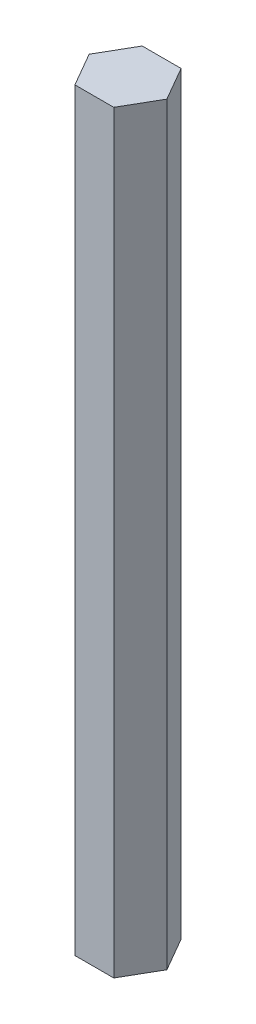
ISO-10303-21;
HEADER;
FILE_DESCRIPTION(('STEP AP214'),'2;1');
FILE_NAME('part.step','',(''),(''),'','','');
FILE_SCHEMA(('AUTOMOTIVE_DESIGN { 1 0 10303 214 1 1 1 1 }'));
ENDSEC;
DATA;
#1=APPLICATION_CONTEXT('core data for automotive mechanical design processes');
#2=APPLICATION_PROTOCOL_DEFINITION('international standard','automotive_design',2000,#1);
#3=PRODUCT_CONTEXT('',#1,'mechanical');
#4=PRODUCT('Part','Part','',(#3));
#5=PRODUCT_RELATED_PRODUCT_CATEGORY('part','',(#4));
#6=PRODUCT_DEFINITION_FORMATION('','',#4);
#7=PRODUCT_DEFINITION_CONTEXT('part definition',#1,'design');
#8=PRODUCT_DEFINITION('design','',#6,#7);
#9=PRODUCT_DEFINITION_SHAPE('','',#8);
#10=(LENGTH_UNIT() NAMED_UNIT(*) SI_UNIT(.MILLI.,.METRE.));
#11=(NAMED_UNIT(*) PLANE_ANGLE_UNIT() SI_UNIT($,.RADIAN.));
#12=(NAMED_UNIT(*) SI_UNIT($,.STERADIAN.) SOLID_ANGLE_UNIT());
#13=UNCERTAINTY_MEASURE_WITH_UNIT(LENGTH_MEASURE(1.E-05),#10,'distance_accuracy_value','');
#14=(GEOMETRIC_REPRESENTATION_CONTEXT(3) GLOBAL_UNCERTAINTY_ASSIGNED_CONTEXT((#13)) GLOBAL_UNIT_ASSIGNED_CONTEXT((#10,
#11,#12)) REPRESENTATION_CONTEXT('',''));
#15=CARTESIAN_POINT('',(0.,0.,0.));
#16=DIRECTION('',(0.,0.,1.));
#17=DIRECTION('',(1.,0.,0.));
#18=AXIS2_PLACEMENT_3D('',#15,#16,#17);
#19=CARTESIAN_POINT('',(-3.66617420935413,142.24,-6.35));
#20=DIRECTION('',(0.866025403784439,0.,0.5));
#21=DIRECTION('',(0.5,0.,-0.866025403784439));
#22=AXIS2_PLACEMENT_3D('',#19,#20,#21);
#23=PLANE('',#22);
#24=DIRECTION('',(-0.5,0.,0.866025403784439));
#25=VECTOR('',#24,1.);
#26=CARTESIAN_POINT('',(-3.66617420935413,0.,-6.35));
#27=LINE('',#26,#25);
#28=CARTESIAN_POINT('',(-3.66617420935413,0.,-6.35));
#29=VERTEX_POINT('',#28);
#30=CARTESIAN_POINT('',(-7.33234841870825,0.,0.));
#31=VERTEX_POINT('',#30);
#32=EDGE_CURVE('E127',#29,#31,#27,.T.);
#33=ORIENTED_EDGE('',*,*,#32,.T.);
#34=DIRECTION('',(0.,-1.,0.));
#35=VECTOR('',#34,1.);
#36=CARTESIAN_POINT('',(-7.33234841870825,142.24,0.));
#37=LINE('',#36,#35);
#38=CARTESIAN_POINT('',(-7.33234841870825,142.24,0.));
#39=VERTEX_POINT('',#38);
#40=EDGE_CURVE('E11',#39,#31,#37,.T.);
#41=ORIENTED_EDGE('',*,*,#40,.F.);
#42=DIRECTION('',(-0.5,0.,0.866025403784439));
#43=VECTOR('',#42,1.);
#44=CARTESIAN_POINT('',(-3.66617420935413,142.24,-6.35));
#45=LINE('',#44,#43);
#46=CARTESIAN_POINT('',(-3.66617420935413,142.24,-6.35));
#47=VERTEX_POINT('',#46);
#48=EDGE_CURVE('E137',#47,#39,#45,.T.);
#49=ORIENTED_EDGE('',*,*,#48,.F.);
#50=DIRECTION('',(0.,-1.,0.));
#51=VECTOR('',#50,1.);
#52=CARTESIAN_POINT('',(-3.66617420935413,142.24,-6.35));
#53=LINE('',#52,#51);
#54=EDGE_CURVE('E123',#47,#29,#53,.T.);
#55=ORIENTED_EDGE('',*,*,#54,.T.);
#56=EDGE_LOOP('',(#33,#41,#49,#55));
#57=FACE_BOUND('',#56,.T.);
#58=ADVANCED_FACE('F43',(#57),#23,.F.);
#59=CARTESIAN_POINT('',(-7.33234841870825,142.24,0.));
#60=DIRECTION('',(0.866025403784438,0.,-0.500000000000001));
#61=DIRECTION('',(-0.500000000000001,0.,-0.866025403784438));
#62=AXIS2_PLACEMENT_3D('',#59,#60,#61);
#63=PLANE('',#62);
#64=DIRECTION('',(0.500000000000001,0.,0.866025403784438));
#65=VECTOR('',#64,1.);
#66=CARTESIAN_POINT('',(-7.33234841870825,0.,0.));
#67=LINE('',#66,#65);
#68=CARTESIAN_POINT('',(-3.66617420935412,0.,6.35));
#69=VERTEX_POINT('',#68);
#70=EDGE_CURVE('E130',#31,#69,#67,.T.);
#71=ORIENTED_EDGE('',*,*,#70,.T.);
#72=DIRECTION('',(0.,-1.,0.));
#73=VECTOR('',#72,1.);
#74=CARTESIAN_POINT('',(-3.66617420935412,142.24,6.35));
#75=LINE('',#74,#73);
#76=CARTESIAN_POINT('',(-3.66617420935412,142.24,6.35));
#77=VERTEX_POINT('',#76);
#78=EDGE_CURVE('E51',#77,#69,#75,.T.);
#79=ORIENTED_EDGE('',*,*,#78,.F.);
#80=DIRECTION('',(0.500000000000001,0.,0.866025403784438));
#81=VECTOR('',#80,1.);
#82=CARTESIAN_POINT('',(-7.33234841870825,142.24,0.));
#83=LINE('',#82,#81);
#84=EDGE_CURVE('E96',#39,#77,#83,.T.);
#85=ORIENTED_EDGE('',*,*,#84,.F.);
#86=ORIENTED_EDGE('',*,*,#40,.T.);
#87=EDGE_LOOP('',(#71,#79,#85,#86));
#88=FACE_BOUND('',#87,.T.);
#89=ADVANCED_FACE('F161',(#88),#63,.F.);
#90=CARTESIAN_POINT('',(-3.66617420935412,142.24,6.35));
#91=DIRECTION('',(0.,0.,-1.));
#92=DIRECTION('',(-1.,0.,0.));
#93=AXIS2_PLACEMENT_3D('',#90,#91,#92);
#94=PLANE('',#93);
#95=DIRECTION('',(1.,0.,0.));
#96=VECTOR('',#95,1.);
#97=CARTESIAN_POINT('',(-3.66617420935412,0.,6.35));
#98=LINE('',#97,#96);
#99=CARTESIAN_POINT('',(3.66617420935413,0.,6.35));
#100=VERTEX_POINT('',#99);
#101=EDGE_CURVE('E132',#69,#100,#98,.T.);
#102=ORIENTED_EDGE('',*,*,#101,.T.);
#103=DIRECTION('',(0.,-1.,0.));
#104=VECTOR('',#103,1.);
#105=CARTESIAN_POINT('',(3.66617420935413,142.24,6.35));
#106=LINE('',#105,#104);
#107=CARTESIAN_POINT('',(3.66617420935413,142.24,6.35));
#108=VERTEX_POINT('',#107);
#109=EDGE_CURVE('E118',#108,#100,#106,.T.);
#110=ORIENTED_EDGE('',*,*,#109,.F.);
#111=DIRECTION('',(1.,0.,0.));
#112=VECTOR('',#111,1.);
#113=CARTESIAN_POINT('',(-3.66617420935412,142.24,6.35));
#114=LINE('',#113,#112);
#115=EDGE_CURVE('E109',#77,#108,#114,.T.);
#116=ORIENTED_EDGE('',*,*,#115,.F.);
#117=ORIENTED_EDGE('',*,*,#78,.T.);
#118=EDGE_LOOP('',(#102,#110,#116,#117));
#119=FACE_BOUND('',#118,.T.);
#120=ADVANCED_FACE('F143',(#119),#94,.F.);
#121=CARTESIAN_POINT('',(3.66617420935413,142.24,6.35));
#122=DIRECTION('',(-0.866025403784439,0.,-0.5));
#123=DIRECTION('',(-0.5,0.,0.866025403784439));
#124=AXIS2_PLACEMENT_3D('',#121,#122,#123);
#125=PLANE('',#124);
#126=DIRECTION('',(0.5,0.,-0.866025403784439));
#127=VECTOR('',#126,1.);
#128=CARTESIAN_POINT('',(3.66617420935413,0.,6.35));
#129=LINE('',#128,#127);
#130=CARTESIAN_POINT('',(7.33234841870825,0.,0.));
#131=VERTEX_POINT('',#130);
#132=EDGE_CURVE('E117',#100,#131,#129,.T.);
#133=ORIENTED_EDGE('',*,*,#132,.T.);
#134=DIRECTION('',(0.,-1.,0.));
#135=VECTOR('',#134,1.);
#136=CARTESIAN_POINT('',(7.33234841870825,142.24,0.));
#137=LINE('',#136,#135);
#138=CARTESIAN_POINT('',(7.33234841870825,142.24,0.));
#139=VERTEX_POINT('',#138);
#140=EDGE_CURVE('E114',#139,#131,#137,.T.);
#141=ORIENTED_EDGE('',*,*,#140,.F.);
#142=DIRECTION('',(0.5,0.,-0.866025403784439));
#143=VECTOR('',#142,1.);
#144=CARTESIAN_POINT('',(3.66617420935413,142.24,6.35));
#145=LINE('',#144,#143);
#146=EDGE_CURVE('E103',#108,#139,#145,.T.);
#147=ORIENTED_EDGE('',*,*,#146,.F.);
#148=ORIENTED_EDGE('',*,*,#109,.T.);
#149=EDGE_LOOP('',(#133,#141,#147,#148));
#150=FACE_BOUND('',#149,.T.);
#151=ADVANCED_FACE('F115',(#150),#125,.F.);
#152=CARTESIAN_POINT('',(7.33234841870825,142.24,0.));
#153=DIRECTION('',(-0.866025403784439,0.,0.5));
#154=DIRECTION('',(0.5,0.,0.866025403784439));
#155=AXIS2_PLACEMENT_3D('',#152,#153,#154);
#156=PLANE('',#155);
#157=DIRECTION('',(-0.5,0.,-0.866025403784439));
#158=VECTOR('',#157,1.);
#159=CARTESIAN_POINT('',(7.33234841870825,0.,0.));
#160=LINE('',#159,#158);
#161=CARTESIAN_POINT('',(3.66617420935413,0.,-6.35));
#162=VERTEX_POINT('',#161);
#163=EDGE_CURVE('E82',#131,#162,#160,.T.);
#164=ORIENTED_EDGE('',*,*,#163,.T.);
#165=DIRECTION('',(0.,-1.,0.));
#166=VECTOR('',#165,1.);
#167=CARTESIAN_POINT('',(3.66617420935413,142.24,-6.35));
#168=LINE('',#167,#166);
#169=CARTESIAN_POINT('',(3.66617420935413,142.24,-6.35));
#170=VERTEX_POINT('',#169);
#171=EDGE_CURVE('E119',#170,#162,#168,.T.);
#172=ORIENTED_EDGE('',*,*,#171,.F.);
#173=DIRECTION('',(-0.5,0.,-0.866025403784439));
#174=VECTOR('',#173,1.);
#175=CARTESIAN_POINT('',(7.33234841870825,142.24,0.));
#176=LINE('',#175,#174);
#177=EDGE_CURVE('E107',#139,#170,#176,.T.);
#178=ORIENTED_EDGE('',*,*,#177,.F.);
#179=ORIENTED_EDGE('',*,*,#140,.T.);
#180=EDGE_LOOP('',(#164,#172,#178,#179));
#181=FACE_BOUND('',#180,.T.);
#182=ADVANCED_FACE('F121',(#181),#156,.F.);
#183=CARTESIAN_POINT('',(3.66617420935413,142.24,-6.35));
#184=DIRECTION('',(0.,0.,1.));
#185=DIRECTION('',(1.,0.,0.));
#186=AXIS2_PLACEMENT_3D('',#183,#184,#185);
#187=PLANE('',#186);
#188=DIRECTION('',(-1.,0.,0.));
#189=VECTOR('',#188,1.);
#190=CARTESIAN_POINT('',(3.66617420935413,0.,-6.35));
#191=LINE('',#190,#189);
#192=EDGE_CURVE('E88',#162,#29,#191,.T.);
#193=ORIENTED_EDGE('',*,*,#192,.T.);
#194=ORIENTED_EDGE('',*,*,#54,.F.);
#195=DIRECTION('',(-1.,0.,0.));
#196=VECTOR('',#195,1.);
#197=CARTESIAN_POINT('',(3.66617420935413,142.24,-6.35));
#198=LINE('',#197,#196);
#199=EDGE_CURVE('E59',#170,#47,#198,.T.);
#200=ORIENTED_EDGE('',*,*,#199,.F.);
#201=ORIENTED_EDGE('',*,*,#171,.T.);
#202=EDGE_LOOP('',(#193,#194,#200,#201));
#203=FACE_BOUND('',#202,.T.);
#204=ADVANCED_FACE('F150',(#203),#187,.F.);
#205=CARTESIAN_POINT('',(0.,142.24,0.));
#206=DIRECTION('',(0.,1.,0.));
#207=DIRECTION('',(0.,0.,1.));
#208=AXIS2_PLACEMENT_3D('',#205,#206,#207);
#209=PLANE('',#208);
#210=ORIENTED_EDGE('',*,*,#48,.T.);
#211=ORIENTED_EDGE('',*,*,#84,.T.);
#212=ORIENTED_EDGE('',*,*,#115,.T.);
#213=ORIENTED_EDGE('',*,*,#146,.T.);
#214=ORIENTED_EDGE('',*,*,#177,.T.);
#215=ORIENTED_EDGE('',*,*,#199,.T.);
#216=EDGE_LOOP('',(#210,#211,#212,#213,#214,#215));
#217=FACE_BOUND('',#216,.T.);
#218=ADVANCED_FACE('F105',(#217),#209,.T.);
#219=CARTESIAN_POINT('',(0.,0.,0.));
#220=DIRECTION('',(0.,1.,0.));
#221=DIRECTION('',(0.,0.,1.));
#222=AXIS2_PLACEMENT_3D('',#219,#220,#221);
#223=PLANE('',#222);
#224=ORIENTED_EDGE('',*,*,#32,.F.);
#225=ORIENTED_EDGE('',*,*,#192,.F.);
#226=ORIENTED_EDGE('',*,*,#163,.F.);
#227=ORIENTED_EDGE('',*,*,#132,.F.);
#228=ORIENTED_EDGE('',*,*,#101,.F.);
#229=ORIENTED_EDGE('',*,*,#70,.F.);
#230=EDGE_LOOP('',(#224,#225,#226,#227,#228,#229));
#231=FACE_BOUND('',#230,.T.);
#232=ADVANCED_FACE('F146',(#231),#223,.F.);
#233=CLOSED_SHELL('',(#58,#89,#120,#151,#182,#204,#218,#232));
#234=MANIFOLD_SOLID_BREP('B2',#233);
#235=ADVANCED_BREP_SHAPE_REPRESENTATION('',(#18,#234),#14);
#236=SHAPE_DEFINITION_REPRESENTATION(#9,#235);
ENDSEC;
END-ISO-10303-21;
